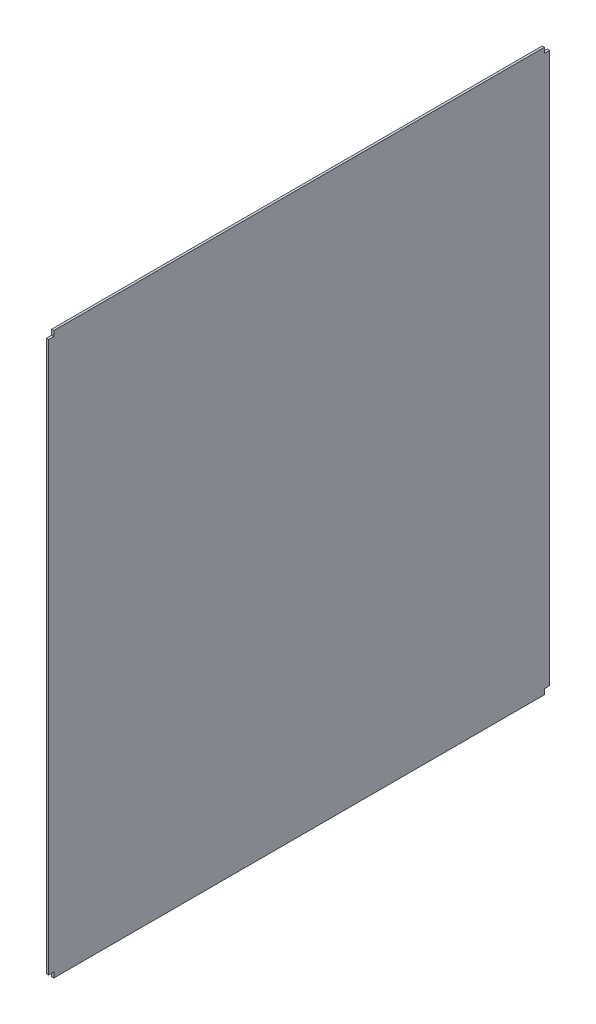
ISO-10303-21;
HEADER;
FILE_DESCRIPTION(('STEP AP214'),'2;1');
FILE_NAME('part.step','',(''),(''),'','','');
FILE_SCHEMA(('AUTOMOTIVE_DESIGN { 1 0 10303 214 1 1 1 1 }'));
ENDSEC;
DATA;
#1=APPLICATION_CONTEXT('core data for automotive mechanical design processes');
#2=APPLICATION_PROTOCOL_DEFINITION('international standard','automotive_design',2000,#1);
#3=PRODUCT_CONTEXT('',#1,'mechanical');
#4=PRODUCT('Part','Part','',(#3));
#5=PRODUCT_RELATED_PRODUCT_CATEGORY('part','',(#4));
#6=PRODUCT_DEFINITION_FORMATION('','',#4);
#7=PRODUCT_DEFINITION_CONTEXT('part definition',#1,'design');
#8=PRODUCT_DEFINITION('design','',#6,#7);
#9=PRODUCT_DEFINITION_SHAPE('','',#8);
#10=(LENGTH_UNIT() NAMED_UNIT(*) SI_UNIT(.MILLI.,.METRE.));
#11=(NAMED_UNIT(*) PLANE_ANGLE_UNIT() SI_UNIT($,.RADIAN.));
#12=(NAMED_UNIT(*) SI_UNIT($,.STERADIAN.) SOLID_ANGLE_UNIT());
#13=UNCERTAINTY_MEASURE_WITH_UNIT(LENGTH_MEASURE(1.E-05),#10,'distance_accuracy_value','');
#14=(GEOMETRIC_REPRESENTATION_CONTEXT(3) GLOBAL_UNCERTAINTY_ASSIGNED_CONTEXT((#13)) GLOBAL_UNIT_ASSIGNED_CONTEXT((#10,
#11,#12)) REPRESENTATION_CONTEXT('',''));
#15=CARTESIAN_POINT('',(0.,0.,0.));
#16=DIRECTION('',(0.,0.,1.));
#17=DIRECTION('',(1.,0.,0.));
#18=AXIS2_PLACEMENT_3D('',#15,#16,#17);
#19=CARTESIAN_POINT('',(0.,296.058970975834,-331.537010254972));
#20=DIRECTION('',(1.,0.,0.));
#21=DIRECTION('',(0.,0.,-1.));
#22=AXIS2_PLACEMENT_3D('',#19,#20,#21);
#23=PLANE('',#22);
#24=DIRECTION('',(0.,1.,0.));
#25=VECTOR('',#24,1.);
#26=CARTESIAN_POINT('',(0.,-78.9410290241662,-659.537010254972));
#27=LINE('',#26,#25);
#28=CARTESIAN_POINT('',(0.,-78.9410290241662,-659.537010254972));
#29=VERTEX_POINT('',#28);
#30=CARTESIAN_POINT('',(0.,-71.9410290241662,-659.537010254972));
#31=VERTEX_POINT('',#30);
#32=EDGE_CURVE('E175',#29,#31,#27,.T.);
#33=ORIENTED_EDGE('',*,*,#32,.F.);
#34=DIRECTION('',(0.,0.,-1.));
#35=VECTOR('',#34,1.);
#36=CARTESIAN_POINT('',(0.,-78.9410290241662,-3.53701025497244));
#37=LINE('',#36,#35);
#38=CARTESIAN_POINT('',(0.,-78.9410290241662,-3.5370102549724));
#39=VERTEX_POINT('',#38);
#40=EDGE_CURVE('E170',#39,#29,#37,.T.);
#41=ORIENTED_EDGE('',*,*,#40,.F.);
#42=DIRECTION('',(0.,1.,0.));
#43=VECTOR('',#42,1.);
#44=CARTESIAN_POINT('',(0.,-71.9410290241662,-3.53701025497241));
#45=LINE('',#44,#43);
#46=CARTESIAN_POINT('',(0.,-71.9410290241662,-3.5370102549724));
#47=VERTEX_POINT('',#46);
#48=EDGE_CURVE('E164',#47,#39,#45,.F.);
#49=ORIENTED_EDGE('',*,*,#48,.F.);
#50=DIRECTION('',(0.,0.,-1.));
#51=VECTOR('',#50,1.);
#52=CARTESIAN_POINT('',(0.,-71.9410290241662,3.46298974502758));
#53=LINE('',#52,#51);
#54=CARTESIAN_POINT('',(0.,-71.9410290241662,3.46298974502757));
#55=VERTEX_POINT('',#54);
#56=EDGE_CURVE('E158',#55,#47,#53,.T.);
#57=ORIENTED_EDGE('',*,*,#56,.F.);
#58=DIRECTION('',(0.,1.,0.));
#59=VECTOR('',#58,1.);
#60=CARTESIAN_POINT('',(0.,664.058970975834,3.46298974502758));
#61=LINE('',#60,#59);
#62=CARTESIAN_POINT('',(0.,664.058970975834,3.46298974502757));
#63=VERTEX_POINT('',#62);
#64=EDGE_CURVE('E152',#63,#55,#61,.F.);
#65=ORIENTED_EDGE('',*,*,#64,.F.);
#66=DIRECTION('',(0.,0.,1.));
#67=VECTOR('',#66,1.);
#68=CARTESIAN_POINT('',(0.,664.058970975834,-3.53701025497241));
#69=LINE('',#68,#67);
#70=CARTESIAN_POINT('',(0.,664.058970975834,-3.5370102549724));
#71=VERTEX_POINT('',#70);
#72=EDGE_CURVE('E146',#71,#63,#69,.T.);
#73=ORIENTED_EDGE('',*,*,#72,.F.);
#74=DIRECTION('',(0.,1.,0.));
#75=VECTOR('',#74,1.);
#76=CARTESIAN_POINT('',(0.,671.058970975834,-3.53701025497241));
#77=LINE('',#76,#75);
#78=CARTESIAN_POINT('',(0.,671.058970975834,-3.5370102549724));
#79=VERTEX_POINT('',#78);
#80=EDGE_CURVE('E140',#79,#71,#77,.F.);
#81=ORIENTED_EDGE('',*,*,#80,.F.);
#82=DIRECTION('',(0.,0.,1.));
#83=VECTOR('',#82,1.);
#84=CARTESIAN_POINT('',(0.,671.058970975834,-659.537010254972));
#85=LINE('',#84,#83);
#86=CARTESIAN_POINT('',(0.,671.058970975834,-659.537010254972));
#87=VERTEX_POINT('',#86);
#88=EDGE_CURVE('E134',#87,#79,#85,.T.);
#89=ORIENTED_EDGE('',*,*,#88,.F.);
#90=DIRECTION('',(0.,1.,0.));
#91=VECTOR('',#90,1.);
#92=CARTESIAN_POINT('',(0.,664.058970975834,-659.537010254972));
#93=LINE('',#92,#91);
#94=CARTESIAN_POINT('',(0.,664.058970975834,-659.537010254972));
#95=VERTEX_POINT('',#94);
#96=EDGE_CURVE('E128',#95,#87,#93,.T.);
#97=ORIENTED_EDGE('',*,*,#96,.F.);
#98=DIRECTION('',(0.,0.,1.));
#99=VECTOR('',#98,1.);
#100=CARTESIAN_POINT('',(0.,664.058970975834,-666.537010254972));
#101=LINE('',#100,#99);
#102=CARTESIAN_POINT('',(0.,664.058970975834,-666.537010254972));
#103=VERTEX_POINT('',#102);
#104=EDGE_CURVE('E104',#103,#95,#101,.T.);
#105=ORIENTED_EDGE('',*,*,#104,.F.);
#106=DIRECTION('',(0.,1.,0.));
#107=VECTOR('',#106,1.);
#108=CARTESIAN_POINT('',(0.,-71.9410290241662,-666.537010254972));
#109=LINE('',#108,#107);
#110=CARTESIAN_POINT('',(0.,-71.9410290241662,-666.537010254972));
#111=VERTEX_POINT('',#110);
#112=EDGE_CURVE('E106',#111,#103,#109,.T.);
#113=ORIENTED_EDGE('',*,*,#112,.F.);
#114=DIRECTION('',(0.,0.,-1.));
#115=VECTOR('',#114,1.);
#116=CARTESIAN_POINT('',(0.,-71.9410290241662,-659.537010254972));
#117=LINE('',#116,#115);
#118=EDGE_CURVE('E20',#31,#111,#117,.T.);
#119=ORIENTED_EDGE('',*,*,#118,.F.);
#120=EDGE_LOOP('',(#33,#41,#49,#57,#65,#73,#81,#89,#97,#105,#113,#119));
#121=FACE_BOUND('',#120,.T.);
#122=ADVANCED_FACE('F17',(#121),#23,.F.);
#123=CARTESIAN_POINT('',(0.,-71.9410290241662,-659.537010254972));
#124=DIRECTION('',(0.,-1.,0.));
#125=DIRECTION('',(0.,0.,-1.));
#126=AXIS2_PLACEMENT_3D('',#123,#124,#125);
#127=PLANE('',#126);
#128=DIRECTION('',(0.,0.,-1.));
#129=VECTOR('',#128,1.);
#130=CARTESIAN_POINT('',(3.,-71.9410290241662,-331.537010254972));
#131=LINE('',#130,#129);
#132=CARTESIAN_POINT('',(3.,-71.9410290241662,-659.537010254972));
#133=VERTEX_POINT('',#132);
#134=CARTESIAN_POINT('',(3.,-71.9410290241662,-666.537010254972));
#135=VERTEX_POINT('',#134);
#136=EDGE_CURVE('E179',#133,#135,#131,.T.);
#137=ORIENTED_EDGE('',*,*,#136,.F.);
#138=DIRECTION('',(-1.,0.,0.));
#139=VECTOR('',#138,1.);
#140=CARTESIAN_POINT('',(0.,-71.9410290241662,-659.537010254972));
#141=LINE('',#140,#139);
#142=EDGE_CURVE('E117',#31,#133,#141,.F.);
#143=ORIENTED_EDGE('',*,*,#142,.F.);
#144=ORIENTED_EDGE('',*,*,#118,.T.);
#145=DIRECTION('',(-1.,0.,0.));
#146=VECTOR('',#145,1.);
#147=CARTESIAN_POINT('',(0.,-71.9410290241662,-666.537010254972));
#148=LINE('',#147,#146);
#149=EDGE_CURVE('E112',#135,#111,#148,.T.);
#150=ORIENTED_EDGE('',*,*,#149,.F.);
#151=EDGE_LOOP('',(#137,#143,#144,#150));
#152=FACE_BOUND('',#151,.T.);
#153=ADVANCED_FACE('F114',(#152),#127,.T.);
#154=CARTESIAN_POINT('',(0.,-71.9410290241662,-666.537010254972));
#155=DIRECTION('',(0.,0.,-1.));
#156=DIRECTION('',(-1.,0.,0.));
#157=AXIS2_PLACEMENT_3D('',#154,#155,#156);
#158=PLANE('',#157);
#159=DIRECTION('',(0.,1.,0.));
#160=VECTOR('',#159,1.);
#161=CARTESIAN_POINT('',(3.,296.058970975834,-666.537010254972));
#162=LINE('',#161,#160);
#163=CARTESIAN_POINT('',(3.,664.058970975834,-666.537010254972));
#164=VERTEX_POINT('',#163);
#165=EDGE_CURVE('E121',#135,#164,#162,.T.);
#166=ORIENTED_EDGE('',*,*,#165,.F.);
#167=ORIENTED_EDGE('',*,*,#149,.T.);
#168=ORIENTED_EDGE('',*,*,#112,.T.);
#169=DIRECTION('',(1.,0.,0.));
#170=VECTOR('',#169,1.);
#171=CARTESIAN_POINT('',(0.,664.058970975834,-666.537010254972));
#172=LINE('',#171,#170);
#173=EDGE_CURVE('E124',#164,#103,#172,.F.);
#174=ORIENTED_EDGE('',*,*,#173,.F.);
#175=EDGE_LOOP('',(#166,#167,#168,#174));
#176=FACE_BOUND('',#175,.T.);
#177=ADVANCED_FACE('F119',(#176),#158,.T.);
#178=CARTESIAN_POINT('',(0.,664.058970975834,-666.537010254972));
#179=DIRECTION('',(0.,1.,0.));
#180=DIRECTION('',(0.,0.,1.));
#181=AXIS2_PLACEMENT_3D('',#178,#179,#180);
#182=PLANE('',#181);
#183=DIRECTION('',(0.,0.,-1.));
#184=VECTOR('',#183,1.);
#185=CARTESIAN_POINT('',(3.,664.058970975834,-331.537010254972));
#186=LINE('',#185,#184);
#187=CARTESIAN_POINT('',(3.,664.058970975834,-659.537010254972));
#188=VERTEX_POINT('',#187);
#189=EDGE_CURVE('E182',#164,#188,#186,.F.);
#190=ORIENTED_EDGE('',*,*,#189,.F.);
#191=ORIENTED_EDGE('',*,*,#173,.T.);
#192=ORIENTED_EDGE('',*,*,#104,.T.);
#193=DIRECTION('',(-1.,0.,0.));
#194=VECTOR('',#193,1.);
#195=CARTESIAN_POINT('',(0.,664.058970975834,-659.537010254972));
#196=LINE('',#195,#194);
#197=EDGE_CURVE('E131',#188,#95,#196,.T.);
#198=ORIENTED_EDGE('',*,*,#197,.F.);
#199=EDGE_LOOP('',(#190,#191,#192,#198));
#200=FACE_BOUND('',#199,.T.);
#201=ADVANCED_FACE('F233',(#200),#182,.T.);
#202=CARTESIAN_POINT('',(0.,664.058970975834,-659.537010254972));
#203=DIRECTION('',(0.,0.,-1.));
#204=DIRECTION('',(-1.,0.,0.));
#205=AXIS2_PLACEMENT_3D('',#202,#203,#204);
#206=PLANE('',#205);
#207=DIRECTION('',(0.,1.,0.));
#208=VECTOR('',#207,1.);
#209=CARTESIAN_POINT('',(3.,296.058970975834,-659.537010254972));
#210=LINE('',#209,#208);
#211=CARTESIAN_POINT('',(3.,671.058970975834,-659.537010254972));
#212=VERTEX_POINT('',#211);
#213=EDGE_CURVE('E185',#188,#212,#210,.T.);
#214=ORIENTED_EDGE('',*,*,#213,.F.);
#215=ORIENTED_EDGE('',*,*,#197,.T.);
#216=ORIENTED_EDGE('',*,*,#96,.T.);
#217=DIRECTION('',(1.,0.,0.));
#218=VECTOR('',#217,1.);
#219=CARTESIAN_POINT('',(0.,671.058970975834,-659.537010254972));
#220=LINE('',#219,#218);
#221=EDGE_CURVE('E137',#212,#87,#220,.F.);
#222=ORIENTED_EDGE('',*,*,#221,.F.);
#223=EDGE_LOOP('',(#214,#215,#216,#222));
#224=FACE_BOUND('',#223,.T.);
#225=ADVANCED_FACE('F230',(#224),#206,.T.);
#226=CARTESIAN_POINT('',(0.,671.058970975834,-659.537010254972));
#227=DIRECTION('',(0.,1.,0.));
#228=DIRECTION('',(0.,0.,1.));
#229=AXIS2_PLACEMENT_3D('',#226,#227,#228);
#230=PLANE('',#229);
#231=DIRECTION('',(0.,0.,-1.));
#232=VECTOR('',#231,1.);
#233=CARTESIAN_POINT('',(3.,671.058970975834,-331.537010254972));
#234=LINE('',#233,#232);
#235=CARTESIAN_POINT('',(3.,671.058970975834,-3.53701025497243));
#236=VERTEX_POINT('',#235);
#237=EDGE_CURVE('E188',#212,#236,#234,.F.);
#238=ORIENTED_EDGE('',*,*,#237,.F.);
#239=ORIENTED_EDGE('',*,*,#221,.T.);
#240=ORIENTED_EDGE('',*,*,#88,.T.);
#241=DIRECTION('',(1.,0.,0.));
#242=VECTOR('',#241,1.);
#243=CARTESIAN_POINT('',(0.,671.058970975834,-3.53701025497241));
#244=LINE('',#243,#242);
#245=EDGE_CURVE('E143',#236,#79,#244,.F.);
#246=ORIENTED_EDGE('',*,*,#245,.F.);
#247=EDGE_LOOP('',(#238,#239,#240,#246));
#248=FACE_BOUND('',#247,.T.);
#249=ADVANCED_FACE('F227',(#248),#230,.T.);
#250=CARTESIAN_POINT('',(0.,671.058970975834,-3.53701025497241));
#251=DIRECTION('',(0.,0.,1.));
#252=DIRECTION('',(1.,0.,0.));
#253=AXIS2_PLACEMENT_3D('',#250,#251,#252);
#254=PLANE('',#253);
#255=DIRECTION('',(0.,1.,0.));
#256=VECTOR('',#255,1.);
#257=CARTESIAN_POINT('',(3.,296.058970975834,-3.53701025497244));
#258=LINE('',#257,#256);
#259=CARTESIAN_POINT('',(3.,664.058970975834,-3.53701025497242));
#260=VERTEX_POINT('',#259);
#261=EDGE_CURVE('E191',#236,#260,#258,.F.);
#262=ORIENTED_EDGE('',*,*,#261,.F.);
#263=ORIENTED_EDGE('',*,*,#245,.T.);
#264=ORIENTED_EDGE('',*,*,#80,.T.);
#265=DIRECTION('',(1.,0.,0.));
#266=VECTOR('',#265,1.);
#267=CARTESIAN_POINT('',(0.,664.058970975834,-3.53701025497244));
#268=LINE('',#267,#266);
#269=EDGE_CURVE('E149',#260,#71,#268,.F.);
#270=ORIENTED_EDGE('',*,*,#269,.F.);
#271=EDGE_LOOP('',(#262,#263,#264,#270));
#272=FACE_BOUND('',#271,.T.);
#273=ADVANCED_FACE('F224',(#272),#254,.T.);
#274=CARTESIAN_POINT('',(0.,664.058970975834,-3.53701025497241));
#275=DIRECTION('',(0.,1.,0.));
#276=DIRECTION('',(0.,0.,1.));
#277=AXIS2_PLACEMENT_3D('',#274,#275,#276);
#278=PLANE('',#277);
#279=DIRECTION('',(0.,0.,-1.));
#280=VECTOR('',#279,1.);
#281=CARTESIAN_POINT('',(3.,664.058970975834,-331.537010254972));
#282=LINE('',#281,#280);
#283=CARTESIAN_POINT('',(3.,664.058970975834,3.46298974502758));
#284=VERTEX_POINT('',#283);
#285=EDGE_CURVE('E194',#260,#284,#282,.F.);
#286=ORIENTED_EDGE('',*,*,#285,.F.);
#287=ORIENTED_EDGE('',*,*,#269,.T.);
#288=ORIENTED_EDGE('',*,*,#72,.T.);
#289=DIRECTION('',(1.,0.,0.));
#290=VECTOR('',#289,1.);
#291=CARTESIAN_POINT('',(0.,664.058970975834,3.46298974502758));
#292=LINE('',#291,#290);
#293=EDGE_CURVE('E155',#284,#63,#292,.F.);
#294=ORIENTED_EDGE('',*,*,#293,.F.);
#295=EDGE_LOOP('',(#286,#287,#288,#294));
#296=FACE_BOUND('',#295,.T.);
#297=ADVANCED_FACE('F221',(#296),#278,.T.);
#298=CARTESIAN_POINT('',(0.,664.058970975834,3.46298974502758));
#299=DIRECTION('',(0.,0.,1.));
#300=DIRECTION('',(1.,0.,0.));
#301=AXIS2_PLACEMENT_3D('',#298,#299,#300);
#302=PLANE('',#301);
#303=DIRECTION('',(0.,1.,0.));
#304=VECTOR('',#303,1.);
#305=CARTESIAN_POINT('',(3.,296.058970975834,3.46298974502757));
#306=LINE('',#305,#304);
#307=CARTESIAN_POINT('',(3.,-71.9410290241662,3.46298974502758));
#308=VERTEX_POINT('',#307);
#309=EDGE_CURVE('E197',#284,#308,#306,.F.);
#310=ORIENTED_EDGE('',*,*,#309,.F.);
#311=ORIENTED_EDGE('',*,*,#293,.T.);
#312=ORIENTED_EDGE('',*,*,#64,.T.);
#313=DIRECTION('',(1.,0.,0.));
#314=VECTOR('',#313,1.);
#315=CARTESIAN_POINT('',(0.,-71.9410290241662,3.46298974502758));
#316=LINE('',#315,#314);
#317=EDGE_CURVE('E161',#308,#55,#316,.F.);
#318=ORIENTED_EDGE('',*,*,#317,.F.);
#319=EDGE_LOOP('',(#310,#311,#312,#318));
#320=FACE_BOUND('',#319,.T.);
#321=ADVANCED_FACE('F218',(#320),#302,.T.);
#322=CARTESIAN_POINT('',(0.,-71.9410290241662,3.46298974502758));
#323=DIRECTION('',(0.,-1.,0.));
#324=DIRECTION('',(0.,0.,-1.));
#325=AXIS2_PLACEMENT_3D('',#322,#323,#324);
#326=PLANE('',#325);
#327=DIRECTION('',(0.,0.,-1.));
#328=VECTOR('',#327,1.);
#329=CARTESIAN_POINT('',(3.,-71.9410290241662,-331.537010254972));
#330=LINE('',#329,#328);
#331=CARTESIAN_POINT('',(3.,-71.9410290241662,-3.53701025497242));
#332=VERTEX_POINT('',#331);
#333=EDGE_CURVE('E200',#308,#332,#330,.T.);
#334=ORIENTED_EDGE('',*,*,#333,.F.);
#335=ORIENTED_EDGE('',*,*,#317,.T.);
#336=ORIENTED_EDGE('',*,*,#56,.T.);
#337=DIRECTION('',(1.,0.,0.));
#338=VECTOR('',#337,1.);
#339=CARTESIAN_POINT('',(0.,-71.9410290241662,-3.53701025497241));
#340=LINE('',#339,#338);
#341=EDGE_CURVE('E167',#332,#47,#340,.F.);
#342=ORIENTED_EDGE('',*,*,#341,.F.);
#343=EDGE_LOOP('',(#334,#335,#336,#342));
#344=FACE_BOUND('',#343,.T.);
#345=ADVANCED_FACE('F215',(#344),#326,.T.);
#346=CARTESIAN_POINT('',(0.,-71.9410290241662,-3.53701025497241));
#347=DIRECTION('',(0.,0.,1.));
#348=DIRECTION('',(1.,0.,0.));
#349=AXIS2_PLACEMENT_3D('',#346,#347,#348);
#350=PLANE('',#349);
#351=DIRECTION('',(0.,1.,0.));
#352=VECTOR('',#351,1.);
#353=CARTESIAN_POINT('',(3.,296.058970975834,-3.53701025497244));
#354=LINE('',#353,#352);
#355=CARTESIAN_POINT('',(3.,-78.9410290241662,-3.53701025497242));
#356=VERTEX_POINT('',#355);
#357=EDGE_CURVE('E203',#332,#356,#354,.F.);
#358=ORIENTED_EDGE('',*,*,#357,.F.);
#359=ORIENTED_EDGE('',*,*,#341,.T.);
#360=ORIENTED_EDGE('',*,*,#48,.T.);
#361=DIRECTION('',(1.,0.,0.));
#362=VECTOR('',#361,1.);
#363=CARTESIAN_POINT('',(0.,-78.9410290241662,-3.53701025497244));
#364=LINE('',#363,#362);
#365=EDGE_CURVE('E172',#356,#39,#364,.F.);
#366=ORIENTED_EDGE('',*,*,#365,.F.);
#367=EDGE_LOOP('',(#358,#359,#360,#366));
#368=FACE_BOUND('',#367,.T.);
#369=ADVANCED_FACE('F212',(#368),#350,.T.);
#370=CARTESIAN_POINT('',(0.,-78.9410290241662,-3.53701025497244));
#371=DIRECTION('',(0.,-1.,0.));
#372=DIRECTION('',(0.,0.,-1.));
#373=AXIS2_PLACEMENT_3D('',#370,#371,#372);
#374=PLANE('',#373);
#375=DIRECTION('',(0.,0.,-1.));
#376=VECTOR('',#375,1.);
#377=CARTESIAN_POINT('',(3.,-78.9410290241662,-331.537010254972));
#378=LINE('',#377,#376);
#379=CARTESIAN_POINT('',(3.,-78.9410290241662,-659.537010254972));
#380=VERTEX_POINT('',#379);
#381=EDGE_CURVE('E26',#356,#380,#378,.T.);
#382=ORIENTED_EDGE('',*,*,#381,.F.);
#383=ORIENTED_EDGE('',*,*,#365,.T.);
#384=ORIENTED_EDGE('',*,*,#40,.T.);
#385=DIRECTION('',(-1.,0.,0.));
#386=VECTOR('',#385,1.);
#387=CARTESIAN_POINT('',(0.,-78.9410290241662,-659.537010254972));
#388=LINE('',#387,#386);
#389=EDGE_CURVE('E35',#380,#29,#388,.T.);
#390=ORIENTED_EDGE('',*,*,#389,.F.);
#391=EDGE_LOOP('',(#382,#383,#384,#390));
#392=FACE_BOUND('',#391,.T.);
#393=ADVANCED_FACE('F210',(#392),#374,.T.);
#394=CARTESIAN_POINT('',(0.,-78.9410290241662,-659.537010254972));
#395=DIRECTION('',(0.,0.,-1.));
#396=DIRECTION('',(-1.,0.,0.));
#397=AXIS2_PLACEMENT_3D('',#394,#395,#396);
#398=PLANE('',#397);
#399=DIRECTION('',(0.,1.,0.));
#400=VECTOR('',#399,1.);
#401=CARTESIAN_POINT('',(3.,296.058970975834,-659.537010254972));
#402=LINE('',#401,#400);
#403=EDGE_CURVE('E11',#380,#133,#402,.T.);
#404=ORIENTED_EDGE('',*,*,#403,.F.);
#405=ORIENTED_EDGE('',*,*,#389,.T.);
#406=ORIENTED_EDGE('',*,*,#32,.T.);
#407=ORIENTED_EDGE('',*,*,#142,.T.);
#408=EDGE_LOOP('',(#404,#405,#406,#407));
#409=FACE_BOUND('',#408,.T.);
#410=ADVANCED_FACE('F235',(#409),#398,.T.);
#411=CARTESIAN_POINT('',(3.,296.058970975834,-331.537010254972));
#412=DIRECTION('',(1.,0.,0.));
#413=DIRECTION('',(0.,0.,-1.));
#414=AXIS2_PLACEMENT_3D('',#411,#412,#413);
#415=PLANE('',#414);
#416=ORIENTED_EDGE('',*,*,#381,.T.);
#417=ORIENTED_EDGE('',*,*,#403,.T.);
#418=ORIENTED_EDGE('',*,*,#136,.T.);
#419=ORIENTED_EDGE('',*,*,#165,.T.);
#420=ORIENTED_EDGE('',*,*,#189,.T.);
#421=ORIENTED_EDGE('',*,*,#213,.T.);
#422=ORIENTED_EDGE('',*,*,#237,.T.);
#423=ORIENTED_EDGE('',*,*,#261,.T.);
#424=ORIENTED_EDGE('',*,*,#285,.T.);
#425=ORIENTED_EDGE('',*,*,#309,.T.);
#426=ORIENTED_EDGE('',*,*,#333,.T.);
#427=ORIENTED_EDGE('',*,*,#357,.T.);
#428=EDGE_LOOP('',(#416,#417,#418,#419,#420,#421,#422,#423,#424,#425,#426,#427));
#429=FACE_BOUND('',#428,.T.);
#430=ADVANCED_FACE('F208',(#429),#415,.T.);
#431=CLOSED_SHELL('',(#122,#153,#177,#201,#225,#249,#273,#297,#321,#345,#369,#393,#410,#430));
#432=MANIFOLD_SOLID_BREP('B1',#431);
#433=ADVANCED_BREP_SHAPE_REPRESENTATION('',(#18,#432),#14);
#434=SHAPE_DEFINITION_REPRESENTATION(#9,#433);
ENDSEC;
END-ISO-10303-21;
